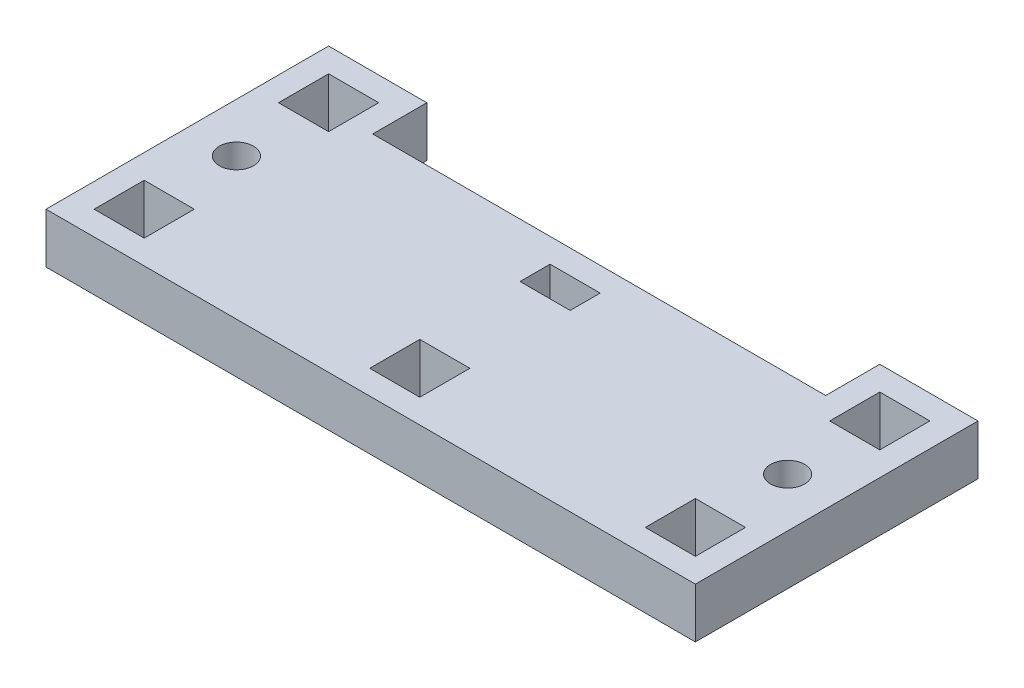
ISO-10303-21;
HEADER;
FILE_DESCRIPTION(('STEP AP214'),'2;1');
FILE_NAME('part.step','',(''),(''),'','','');
FILE_SCHEMA(('AUTOMOTIVE_DESIGN { 1 0 10303 214 1 1 1 1 }'));
ENDSEC;
DATA;
#1=APPLICATION_CONTEXT('core data for automotive mechanical design processes');
#2=APPLICATION_PROTOCOL_DEFINITION('international standard','automotive_design',2000,#1);
#3=PRODUCT_CONTEXT('',#1,'mechanical');
#4=PRODUCT('Part','Part','',(#3));
#5=PRODUCT_RELATED_PRODUCT_CATEGORY('part','',(#4));
#6=PRODUCT_DEFINITION_FORMATION('','',#4);
#7=PRODUCT_DEFINITION_CONTEXT('part definition',#1,'design');
#8=PRODUCT_DEFINITION('design','',#6,#7);
#9=PRODUCT_DEFINITION_SHAPE('','',#8);
#10=(LENGTH_UNIT() NAMED_UNIT(*) SI_UNIT(.MILLI.,.METRE.));
#11=(NAMED_UNIT(*) PLANE_ANGLE_UNIT() SI_UNIT($,.RADIAN.));
#12=(NAMED_UNIT(*) SI_UNIT($,.STERADIAN.) SOLID_ANGLE_UNIT());
#13=UNCERTAINTY_MEASURE_WITH_UNIT(LENGTH_MEASURE(1.E-05),#10,'distance_accuracy_value','');
#14=(GEOMETRIC_REPRESENTATION_CONTEXT(3) GLOBAL_UNCERTAINTY_ASSIGNED_CONTEXT((#13)) GLOBAL_UNIT_ASSIGNED_CONTEXT((#10,
#11,#12)) REPRESENTATION_CONTEXT('',''));
#15=CARTESIAN_POINT('',(0.,0.,0.));
#16=DIRECTION('',(0.,0.,1.));
#17=DIRECTION('',(1.,0.,0.));
#18=AXIS2_PLACEMENT_3D('',#15,#16,#17);
#19=CARTESIAN_POINT('',(0.,6.35,0.));
#20=DIRECTION('',(0.,1.,0.));
#21=DIRECTION('',(0.,0.,1.));
#22=AXIS2_PLACEMENT_3D('',#19,#20,#21);
#23=PLANE('',#22);
#24=CARTESIAN_POINT('',(-34.925,6.34999999999966,0.));
#25=DIRECTION('',(0.,1.,0.));
#26=DIRECTION('',(1.,0.,0.));
#27=AXIS2_PLACEMENT_3D('',#24,#25,#26);
#28=CIRCLE('',#27,2.159);
#29=CARTESIAN_POINT('',(-32.766,6.34999999999968,0.));
#30=VERTEX_POINT('',#29);
#31=EDGE_CURVE('E278',#30,#30,#28,.T.);
#32=ORIENTED_EDGE('',*,*,#31,.F.);
#33=EDGE_LOOP('',(#32));
#34=FACE_BOUND('',#33,.T.);
#35=DIRECTION('',(1.,0.,0.));
#36=VECTOR('',#35,1.);
#37=CARTESIAN_POINT('',(31.75,6.35,14.859));
#38=LINE('',#37,#36);
#39=CARTESIAN_POINT('',(31.75,6.35,14.859));
#40=VERTEX_POINT('',#39);
#41=CARTESIAN_POINT('',(38.1,6.35,14.859));
#42=VERTEX_POINT('',#41);
#43=EDGE_CURVE('E317',#40,#42,#38,.T.);
#44=ORIENTED_EDGE('',*,*,#43,.F.);
#45=DIRECTION('',(0.,0.,1.));
#46=VECTOR('',#45,1.);
#47=CARTESIAN_POINT('',(31.75,6.35,8.509));
#48=LINE('',#47,#46);
#49=CARTESIAN_POINT('',(31.75,6.35,8.509));
#50=VERTEX_POINT('',#49);
#51=EDGE_CURVE('E315',#50,#40,#48,.T.);
#52=ORIENTED_EDGE('',*,*,#51,.F.);
#53=DIRECTION('',(-1.,0.,0.));
#54=VECTOR('',#53,1.);
#55=CARTESIAN_POINT('',(31.75,6.35,8.509));
#56=LINE('',#55,#54);
#57=CARTESIAN_POINT('',(38.1,6.35,8.509));
#58=VERTEX_POINT('',#57);
#59=EDGE_CURVE('E323',#58,#50,#56,.T.);
#60=ORIENTED_EDGE('',*,*,#59,.F.);
#61=DIRECTION('',(0.,0.,-1.));
#62=VECTOR('',#61,1.);
#63=CARTESIAN_POINT('',(38.1,6.35,8.509));
#64=LINE('',#63,#62);
#65=EDGE_CURVE('E320',#42,#58,#64,.T.);
#66=ORIENTED_EDGE('',*,*,#65,.F.);
#67=EDGE_LOOP('',(#44,#52,#60,#66));
#68=FACE_BOUND('',#67,.T.);
#69=DIRECTION('',(-1.,0.,0.));
#70=VECTOR('',#69,1.);
#71=CARTESIAN_POINT('',(31.75,6.35,-14.859));
#72=LINE('',#71,#70);
#73=CARTESIAN_POINT('',(38.1,6.35,-14.859));
#74=VERTEX_POINT('',#73);
#75=CARTESIAN_POINT('',(31.75,6.35,-14.859));
#76=VERTEX_POINT('',#75);
#77=EDGE_CURVE('E354',#74,#76,#72,.T.);
#78=ORIENTED_EDGE('',*,*,#77,.F.);
#79=DIRECTION('',(0.,0.,-1.));
#80=VECTOR('',#79,1.);
#81=CARTESIAN_POINT('',(38.1,6.35,-8.509));
#82=LINE('',#81,#80);
#83=CARTESIAN_POINT('',(38.1,6.35,-8.509));
#84=VERTEX_POINT('',#83);
#85=EDGE_CURVE('E352',#84,#74,#82,.T.);
#86=ORIENTED_EDGE('',*,*,#85,.F.);
#87=DIRECTION('',(1.,0.,0.));
#88=VECTOR('',#87,1.);
#89=CARTESIAN_POINT('',(31.75,6.35,-8.509));
#90=LINE('',#89,#88);
#91=CARTESIAN_POINT('',(31.75,6.35,-8.509));
#92=VERTEX_POINT('',#91);
#93=EDGE_CURVE('E360',#92,#84,#90,.T.);
#94=ORIENTED_EDGE('',*,*,#93,.F.);
#95=DIRECTION('',(0.,0.,1.));
#96=VECTOR('',#95,1.);
#97=CARTESIAN_POINT('',(31.75,6.35,-8.509));
#98=LINE('',#97,#96);
#99=EDGE_CURVE('E357',#76,#92,#98,.T.);
#100=ORIENTED_EDGE('',*,*,#99,.F.);
#101=EDGE_LOOP('',(#78,#86,#94,#100));
#102=FACE_BOUND('',#101,.T.);
#103=DIRECTION('',(-1.,0.,0.));
#104=VECTOR('',#103,1.);
#105=CARTESIAN_POINT('',(-3.175,6.35,8.50899999999999));
#106=LINE('',#105,#104);
#107=CARTESIAN_POINT('',(3.175,6.35,8.50899999999999));
#108=VERTEX_POINT('',#107);
#109=CARTESIAN_POINT('',(-3.175,6.35,8.50899999999999));
#110=VERTEX_POINT('',#109);
#111=EDGE_CURVE('E416',#108,#110,#106,.T.);
#112=ORIENTED_EDGE('',*,*,#111,.F.);
#113=DIRECTION('',(0.,0.,-1.));
#114=VECTOR('',#113,1.);
#115=CARTESIAN_POINT('',(3.175,6.35,8.50899999999999));
#116=LINE('',#115,#114);
#117=CARTESIAN_POINT('',(3.175,6.35,14.859));
#118=VERTEX_POINT('',#117);
#119=EDGE_CURVE('E414',#118,#108,#116,.T.);
#120=ORIENTED_EDGE('',*,*,#119,.F.);
#121=DIRECTION('',(1.,0.,0.));
#122=VECTOR('',#121,1.);
#123=CARTESIAN_POINT('',(-3.175,6.35,14.859));
#124=LINE('',#123,#122);
#125=CARTESIAN_POINT('',(-3.175,6.35,14.859));
#126=VERTEX_POINT('',#125);
#127=EDGE_CURVE('E422',#126,#118,#124,.T.);
#128=ORIENTED_EDGE('',*,*,#127,.F.);
#129=DIRECTION('',(0.,0.,1.));
#130=VECTOR('',#129,1.);
#131=CARTESIAN_POINT('',(-3.175,6.35,8.50899999999999));
#132=LINE('',#131,#130);
#133=EDGE_CURVE('E419',#110,#126,#132,.T.);
#134=ORIENTED_EDGE('',*,*,#133,.F.);
#135=EDGE_LOOP('',(#112,#120,#128,#134));
#136=FACE_BOUND('',#135,.T.);
#137=DIRECTION('',(-1.,0.,0.));
#138=VECTOR('',#137,1.);
#139=CARTESIAN_POINT('',(28.702,6.35,-17.907));
#140=LINE('',#139,#138);
#141=CARTESIAN_POINT('',(41.148,6.35,-17.907));
#142=VERTEX_POINT('',#141);
#143=CARTESIAN_POINT('',(28.702,6.35,-17.907));
#144=VERTEX_POINT('',#143);
#145=EDGE_CURVE('E445',#142,#144,#140,.T.);
#146=ORIENTED_EDGE('',*,*,#145,.T.);
#147=DIRECTION('',(0.,0.,1.));
#148=VECTOR('',#147,1.);
#149=CARTESIAN_POINT('',(28.702,6.35,-11.049));
#150=LINE('',#149,#148);
#151=CARTESIAN_POINT('',(28.702,6.35,-11.049));
#152=VERTEX_POINT('',#151);
#153=EDGE_CURVE('E448',#144,#152,#150,.T.);
#154=ORIENTED_EDGE('',*,*,#153,.T.);
#155=DIRECTION('',(-1.,0.,0.));
#156=VECTOR('',#155,1.);
#157=CARTESIAN_POINT('',(-28.702,6.35,-11.049));
#158=LINE('',#157,#156);
#159=CARTESIAN_POINT('',(-28.702,6.35,-11.049));
#160=VERTEX_POINT('',#159);
#161=EDGE_CURVE('E451',#152,#160,#158,.T.);
#162=ORIENTED_EDGE('',*,*,#161,.T.);
#163=DIRECTION('',(0.,0.,-1.));
#164=VECTOR('',#163,1.);
#165=CARTESIAN_POINT('',(-28.702,6.35,-17.907));
#166=LINE('',#165,#164);
#167=CARTESIAN_POINT('',(-28.702,6.35,-17.907));
#168=VERTEX_POINT('',#167);
#169=EDGE_CURVE('E453',#160,#168,#166,.T.);
#170=ORIENTED_EDGE('',*,*,#169,.T.);
#171=DIRECTION('',(-1.,0.,0.));
#172=VECTOR('',#171,1.);
#173=CARTESIAN_POINT('',(-41.148,6.35,-17.907));
#174=LINE('',#173,#172);
#175=CARTESIAN_POINT('',(-41.148,6.35,-17.907));
#176=VERTEX_POINT('',#175);
#177=EDGE_CURVE('E455',#168,#176,#174,.T.);
#178=ORIENTED_EDGE('',*,*,#177,.T.);
#179=DIRECTION('',(0.,0.,1.));
#180=VECTOR('',#179,1.);
#181=CARTESIAN_POINT('',(-41.148,6.35,17.907));
#182=LINE('',#181,#180);
#183=CARTESIAN_POINT('',(-41.148,6.35,17.907));
#184=VERTEX_POINT('',#183);
#185=EDGE_CURVE('E457',#176,#184,#182,.T.);
#186=ORIENTED_EDGE('',*,*,#185,.T.);
#187=DIRECTION('',(1.,0.,0.));
#188=VECTOR('',#187,1.);
#189=CARTESIAN_POINT('',(-41.148,6.35,17.907));
#190=LINE('',#189,#188);
#191=CARTESIAN_POINT('',(41.148,6.35,17.907));
#192=VERTEX_POINT('',#191);
#193=EDGE_CURVE('E459',#184,#192,#190,.T.);
#194=ORIENTED_EDGE('',*,*,#193,.T.);
#195=DIRECTION('',(0.,0.,-1.));
#196=VECTOR('',#195,1.);
#197=CARTESIAN_POINT('',(41.148,6.35,17.907));
#198=LINE('',#197,#196);
#199=EDGE_CURVE('E461',#192,#142,#198,.T.);
#200=ORIENTED_EDGE('',*,*,#199,.T.);
#201=EDGE_LOOP('',(#146,#154,#162,#170,#178,#186,#194,#200));
#202=FACE_BOUND('',#201,.T.);
#203=DIRECTION('',(-1.,0.,0.));
#204=VECTOR('',#203,1.);
#205=CARTESIAN_POINT('',(-3.175,6.35,-8.00100000000001));
#206=LINE('',#205,#204);
#207=CARTESIAN_POINT('',(3.175,6.35,-8.00100000000001));
#208=VERTEX_POINT('',#207);
#209=CARTESIAN_POINT('',(-3.175,6.35,-8.00100000000001));
#210=VERTEX_POINT('',#209);
#211=EDGE_CURVE('E385',#208,#210,#206,.T.);
#212=ORIENTED_EDGE('',*,*,#211,.F.);
#213=DIRECTION('',(0.,0.,-1.));
#214=VECTOR('',#213,1.);
#215=CARTESIAN_POINT('',(3.175,6.35,-4.19100000000001));
#216=LINE('',#215,#214);
#217=CARTESIAN_POINT('',(3.175,6.35,-4.19100000000001));
#218=VERTEX_POINT('',#217);
#219=EDGE_CURVE('E383',#218,#208,#216,.T.);
#220=ORIENTED_EDGE('',*,*,#219,.F.);
#221=DIRECTION('',(1.,0.,0.));
#222=VECTOR('',#221,1.);
#223=CARTESIAN_POINT('',(-3.175,6.35,-4.19100000000001));
#224=LINE('',#223,#222);
#225=CARTESIAN_POINT('',(-3.175,6.35,-4.19100000000001));
#226=VERTEX_POINT('',#225);
#227=EDGE_CURVE('E391',#226,#218,#224,.T.);
#228=ORIENTED_EDGE('',*,*,#227,.F.);
#229=DIRECTION('',(0.,0.,1.));
#230=VECTOR('',#229,1.);
#231=CARTESIAN_POINT('',(-3.175,6.35,-4.19100000000001));
#232=LINE('',#231,#230);
#233=EDGE_CURVE('E388',#210,#226,#232,.T.);
#234=ORIENTED_EDGE('',*,*,#233,.F.);
#235=EDGE_LOOP('',(#212,#220,#228,#234));
#236=FACE_BOUND('',#235,.T.);
#237=CARTESIAN_POINT('',(34.925,6.35,0.));
#238=DIRECTION('',(0.,1.,0.));
#239=DIRECTION('',(0.,0.,1.));
#240=AXIS2_PLACEMENT_3D('',#237,#238,#239);
#241=CIRCLE('',#240,2.159);
#242=CARTESIAN_POINT('',(34.925,6.35,2.159));
#243=VERTEX_POINT('',#242);
#244=EDGE_CURVE('E346',#243,#243,#241,.T.);
#245=ORIENTED_EDGE('',*,*,#244,.F.);
#246=EDGE_LOOP('',(#245));
#247=FACE_BOUND('',#246,.T.);
#248=DIRECTION('',(1.,0.,0.));
#249=VECTOR('',#248,1.);
#250=CARTESIAN_POINT('',(-31.75,6.34999999999968,-8.50899999999999));
#251=LINE('',#250,#249);
#252=CARTESIAN_POINT('',(-38.1,6.34999999999964,-8.50899999999999));
#253=VERTEX_POINT('',#252);
#254=CARTESIAN_POINT('',(-31.75,6.34999999999968,-8.50899999999999));
#255=VERTEX_POINT('',#254);
#256=EDGE_CURVE('E286',#253,#255,#251,.T.);
#257=ORIENTED_EDGE('',*,*,#256,.F.);
#258=DIRECTION('',(0.,0.,1.));
#259=VECTOR('',#258,1.);
#260=CARTESIAN_POINT('',(-38.1,6.34999999999964,-8.50899999999999));
#261=LINE('',#260,#259);
#262=CARTESIAN_POINT('',(-38.1,6.34999999999964,-14.859));
#263=VERTEX_POINT('',#262);
#264=EDGE_CURVE('E284',#263,#253,#261,.T.);
#265=ORIENTED_EDGE('',*,*,#264,.F.);
#266=DIRECTION('',(-1.,0.,0.));
#267=VECTOR('',#266,1.);
#268=CARTESIAN_POINT('',(-31.75,6.34999999999968,-14.859));
#269=LINE('',#268,#267);
#270=CARTESIAN_POINT('',(-31.75,6.35,-14.859));
#271=VERTEX_POINT('',#270);
#272=EDGE_CURVE('E292',#271,#263,#269,.T.);
#273=ORIENTED_EDGE('',*,*,#272,.F.);
#274=DIRECTION('',(0.,0.,-1.));
#275=VECTOR('',#274,1.);
#276=CARTESIAN_POINT('',(-31.75,6.34999999999968,-8.50899999999999));
#277=LINE('',#276,#275);
#278=EDGE_CURVE('E289',#255,#271,#277,.T.);
#279=ORIENTED_EDGE('',*,*,#278,.F.);
#280=EDGE_LOOP('',(#257,#265,#273,#279));
#281=FACE_BOUND('',#280,.T.);
#282=DIRECTION('',(-1.,0.,0.));
#283=VECTOR('',#282,1.);
#284=CARTESIAN_POINT('',(-31.75,6.34999999999968,8.509));
#285=LINE('',#284,#283);
#286=CARTESIAN_POINT('',(-31.75,6.34999999999968,8.509));
#287=VERTEX_POINT('',#286);
#288=CARTESIAN_POINT('',(-38.1,6.34999999999964,8.509));
#289=VERTEX_POINT('',#288);
#290=EDGE_CURVE('E250',#287,#289,#285,.T.);
#291=ORIENTED_EDGE('',*,*,#290,.F.);
#292=DIRECTION('',(0.,0.,-1.));
#293=VECTOR('',#292,1.);
#294=CARTESIAN_POINT('',(-31.75,6.34999999999968,8.509));
#295=LINE('',#294,#293);
#296=CARTESIAN_POINT('',(-31.75,6.34999999999968,14.859));
#297=VERTEX_POINT('',#296);
#298=EDGE_CURVE('E242',#297,#287,#295,.T.);
#299=ORIENTED_EDGE('',*,*,#298,.F.);
#300=DIRECTION('',(1.,0.,0.));
#301=VECTOR('',#300,1.);
#302=CARTESIAN_POINT('',(-31.75,6.34999999999968,14.859));
#303=LINE('',#302,#301);
#304=CARTESIAN_POINT('',(-38.1,6.35,14.859));
#305=VERTEX_POINT('',#304);
#306=EDGE_CURVE('E264',#305,#297,#303,.T.);
#307=ORIENTED_EDGE('',*,*,#306,.F.);
#308=DIRECTION('',(0.,0.,1.));
#309=VECTOR('',#308,1.);
#310=CARTESIAN_POINT('',(-38.1,6.34999999999964,8.509));
#311=LINE('',#310,#309);
#312=EDGE_CURVE('E262',#289,#305,#311,.T.);
#313=ORIENTED_EDGE('',*,*,#312,.F.);
#314=EDGE_LOOP('',(#291,#299,#307,#313));
#315=FACE_BOUND('',#314,.T.);
#316=ADVANCED_FACE('F33',(#34,#68,#102,#136,#202,#236,#247,#281,#315),#23,.T.);
#317=CARTESIAN_POINT('',(0.,0.,0.));
#318=DIRECTION('',(0.,1.,0.));
#319=DIRECTION('',(0.,0.,1.));
#320=AXIS2_PLACEMENT_3D('',#317,#318,#319);
#321=PLANE('',#320);
#322=CARTESIAN_POINT('',(-34.925,-3.38598395391725E-13,0.));
#323=DIRECTION('',(0.,1.,0.));
#324=DIRECTION('',(1.,0.,0.));
#325=AXIS2_PLACEMENT_3D('',#322,#323,#324);
#326=CIRCLE('',#325,2.159);
#327=CARTESIAN_POINT('',(-32.766,-3.23522170238455E-13,0.));
#328=VERTEX_POINT('',#327);
#329=EDGE_CURVE('E258',#328,#328,#326,.T.);
#330=ORIENTED_EDGE('',*,*,#329,.T.);
#331=EDGE_LOOP('',(#330));
#332=FACE_BOUND('',#331,.T.);
#333=DIRECTION('',(0.,0.,1.));
#334=VECTOR('',#333,1.);
#335=CARTESIAN_POINT('',(31.75,0.,8.509));
#336=LINE('',#335,#334);
#337=CARTESIAN_POINT('',(31.75,0.,8.509));
#338=VERTEX_POINT('',#337);
#339=CARTESIAN_POINT('',(31.75,0.,14.859));
#340=VERTEX_POINT('',#339);
#341=EDGE_CURVE('E314',#338,#340,#336,.T.);
#342=ORIENTED_EDGE('',*,*,#341,.T.);
#343=DIRECTION('',(1.,0.,0.));
#344=VECTOR('',#343,1.);
#345=CARTESIAN_POINT('',(31.75,0.,14.859));
#346=LINE('',#345,#344);
#347=CARTESIAN_POINT('',(38.1,0.,14.859));
#348=VERTEX_POINT('',#347);
#349=EDGE_CURVE('E328',#340,#348,#346,.T.);
#350=ORIENTED_EDGE('',*,*,#349,.T.);
#351=DIRECTION('',(0.,0.,-1.));
#352=VECTOR('',#351,1.);
#353=CARTESIAN_POINT('',(38.1,0.,8.509));
#354=LINE('',#353,#352);
#355=CARTESIAN_POINT('',(38.1,0.,8.509));
#356=VERTEX_POINT('',#355);
#357=EDGE_CURVE('E331',#348,#356,#354,.T.);
#358=ORIENTED_EDGE('',*,*,#357,.T.);
#359=DIRECTION('',(-1.,0.,0.));
#360=VECTOR('',#359,1.);
#361=CARTESIAN_POINT('',(31.75,0.,8.509));
#362=LINE('',#361,#360);
#363=EDGE_CURVE('E318',#356,#338,#362,.T.);
#364=ORIENTED_EDGE('',*,*,#363,.T.);
#365=EDGE_LOOP('',(#342,#350,#358,#364));
#366=FACE_BOUND('',#365,.T.);
#367=DIRECTION('',(0.,0.,-1.));
#368=VECTOR('',#367,1.);
#369=CARTESIAN_POINT('',(38.1,0.,-8.509));
#370=LINE('',#369,#368);
#371=CARTESIAN_POINT('',(38.1,0.,-8.509));
#372=VERTEX_POINT('',#371);
#373=CARTESIAN_POINT('',(38.1,0.,-14.859));
#374=VERTEX_POINT('',#373);
#375=EDGE_CURVE('E349',#372,#374,#370,.T.);
#376=ORIENTED_EDGE('',*,*,#375,.T.);
#377=DIRECTION('',(-1.,0.,0.));
#378=VECTOR('',#377,1.);
#379=CARTESIAN_POINT('',(31.75,0.,-14.859));
#380=LINE('',#379,#378);
#381=CARTESIAN_POINT('',(31.75,0.,-14.859));
#382=VERTEX_POINT('',#381);
#383=EDGE_CURVE('E365',#374,#382,#380,.T.);
#384=ORIENTED_EDGE('',*,*,#383,.T.);
#385=DIRECTION('',(0.,0.,1.));
#386=VECTOR('',#385,1.);
#387=CARTESIAN_POINT('',(31.75,0.,-8.509));
#388=LINE('',#387,#386);
#389=CARTESIAN_POINT('',(31.75,0.,-8.509));
#390=VERTEX_POINT('',#389);
#391=EDGE_CURVE('E368',#382,#390,#388,.T.);
#392=ORIENTED_EDGE('',*,*,#391,.T.);
#393=DIRECTION('',(1.,0.,0.));
#394=VECTOR('',#393,1.);
#395=CARTESIAN_POINT('',(31.75,0.,-8.509));
#396=LINE('',#395,#394);
#397=EDGE_CURVE('E355',#390,#372,#396,.T.);
#398=ORIENTED_EDGE('',*,*,#397,.T.);
#399=EDGE_LOOP('',(#376,#384,#392,#398));
#400=FACE_BOUND('',#399,.T.);
#401=DIRECTION('',(0.,0.,-1.));
#402=VECTOR('',#401,1.);
#403=CARTESIAN_POINT('',(3.175,0.,8.50899999999999));
#404=LINE('',#403,#402);
#405=CARTESIAN_POINT('',(3.175,0.,14.859));
#406=VERTEX_POINT('',#405);
#407=CARTESIAN_POINT('',(3.175,0.,8.50899999999999));
#408=VERTEX_POINT('',#407);
#409=EDGE_CURVE('E413',#406,#408,#404,.T.);
#410=ORIENTED_EDGE('',*,*,#409,.T.);
#411=DIRECTION('',(-1.,0.,0.));
#412=VECTOR('',#411,1.);
#413=CARTESIAN_POINT('',(-3.175,0.,8.50899999999999));
#414=LINE('',#413,#412);
#415=CARTESIAN_POINT('',(-3.175,0.,8.50899999999999));
#416=VERTEX_POINT('',#415);
#417=EDGE_CURVE('E427',#408,#416,#414,.T.);
#418=ORIENTED_EDGE('',*,*,#417,.T.);
#419=DIRECTION('',(0.,0.,1.));
#420=VECTOR('',#419,1.);
#421=CARTESIAN_POINT('',(-3.175,0.,8.50899999999999));
#422=LINE('',#421,#420);
#423=CARTESIAN_POINT('',(-3.175,0.,14.859));
#424=VERTEX_POINT('',#423);
#425=EDGE_CURVE('E430',#416,#424,#422,.T.);
#426=ORIENTED_EDGE('',*,*,#425,.T.);
#427=DIRECTION('',(1.,0.,0.));
#428=VECTOR('',#427,1.);
#429=CARTESIAN_POINT('',(-3.175,0.,14.859));
#430=LINE('',#429,#428);
#431=EDGE_CURVE('E417',#424,#406,#430,.T.);
#432=ORIENTED_EDGE('',*,*,#431,.T.);
#433=EDGE_LOOP('',(#410,#418,#426,#432));
#434=FACE_BOUND('',#433,.T.);
#435=DIRECTION('',(-1.,0.,0.));
#436=VECTOR('',#435,1.);
#437=CARTESIAN_POINT('',(28.702,0.,-17.907));
#438=LINE('',#437,#436);
#439=CARTESIAN_POINT('',(41.148,0.,-17.907));
#440=VERTEX_POINT('',#439);
#441=CARTESIAN_POINT('',(28.702,0.,-17.907));
#442=VERTEX_POINT('',#441);
#443=EDGE_CURVE('E444',#440,#442,#438,.T.);
#444=ORIENTED_EDGE('',*,*,#443,.F.);
#445=DIRECTION('',(0.,0.,-1.));
#446=VECTOR('',#445,1.);
#447=CARTESIAN_POINT('',(41.148,0.,17.907));
#448=LINE('',#447,#446);
#449=CARTESIAN_POINT('',(41.148,0.,17.907));
#450=VERTEX_POINT('',#449);
#451=EDGE_CURVE('E449',#450,#440,#448,.T.);
#452=ORIENTED_EDGE('',*,*,#451,.F.);
#453=DIRECTION('',(1.,0.,0.));
#454=VECTOR('',#453,1.);
#455=CARTESIAN_POINT('',(-41.148,0.,17.907));
#456=LINE('',#455,#454);
#457=CARTESIAN_POINT('',(-41.148,0.,17.907));
#458=VERTEX_POINT('',#457);
#459=EDGE_CURVE('E476',#458,#450,#456,.T.);
#460=ORIENTED_EDGE('',*,*,#459,.F.);
#461=DIRECTION('',(0.,0.,1.));
#462=VECTOR('',#461,1.);
#463=CARTESIAN_POINT('',(-41.148,0.,17.907));
#464=LINE('',#463,#462);
#465=CARTESIAN_POINT('',(-41.148,0.,-17.907));
#466=VERTEX_POINT('',#465);
#467=EDGE_CURVE('E474',#466,#458,#464,.T.);
#468=ORIENTED_EDGE('',*,*,#467,.F.);
#469=DIRECTION('',(-1.,0.,0.));
#470=VECTOR('',#469,1.);
#471=CARTESIAN_POINT('',(-41.148,0.,-17.907));
#472=LINE('',#471,#470);
#473=CARTESIAN_POINT('',(-28.702,0.,-17.907));
#474=VERTEX_POINT('',#473);
#475=EDGE_CURVE('E472',#474,#466,#472,.T.);
#476=ORIENTED_EDGE('',*,*,#475,.F.);
#477=DIRECTION('',(0.,0.,-1.));
#478=VECTOR('',#477,1.);
#479=CARTESIAN_POINT('',(-28.702,0.,-17.907));
#480=LINE('',#479,#478);
#481=CARTESIAN_POINT('',(-28.702,0.,-11.049));
#482=VERTEX_POINT('',#481);
#483=EDGE_CURVE('E470',#482,#474,#480,.T.);
#484=ORIENTED_EDGE('',*,*,#483,.F.);
#485=DIRECTION('',(-1.,0.,0.));
#486=VECTOR('',#485,1.);
#487=CARTESIAN_POINT('',(-28.702,0.,-11.049));
#488=LINE('',#487,#486);
#489=CARTESIAN_POINT('',(28.702,0.,-11.049));
#490=VERTEX_POINT('',#489);
#491=EDGE_CURVE('E468',#490,#482,#488,.T.);
#492=ORIENTED_EDGE('',*,*,#491,.F.);
#493=DIRECTION('',(0.,0.,1.));
#494=VECTOR('',#493,1.);
#495=CARTESIAN_POINT('',(28.702,0.,-11.049));
#496=LINE('',#495,#494);
#497=EDGE_CURVE('E466',#442,#490,#496,.T.);
#498=ORIENTED_EDGE('',*,*,#497,.F.);
#499=EDGE_LOOP('',(#444,#452,#460,#468,#476,#484,#492,#498));
#500=FACE_BOUND('',#499,.T.);
#501=DIRECTION('',(0.,0.,-1.));
#502=VECTOR('',#501,1.);
#503=CARTESIAN_POINT('',(3.175,0.,-4.19100000000001));
#504=LINE('',#503,#502);
#505=CARTESIAN_POINT('',(3.175,0.,-4.19100000000001));
#506=VERTEX_POINT('',#505);
#507=CARTESIAN_POINT('',(3.175,0.,-8.00100000000001));
#508=VERTEX_POINT('',#507);
#509=EDGE_CURVE('E382',#506,#508,#504,.T.);
#510=ORIENTED_EDGE('',*,*,#509,.T.);
#511=DIRECTION('',(-1.,0.,0.));
#512=VECTOR('',#511,1.);
#513=CARTESIAN_POINT('',(-3.175,0.,-8.00100000000001));
#514=LINE('',#513,#512);
#515=CARTESIAN_POINT('',(-3.175,0.,-8.00100000000001));
#516=VERTEX_POINT('',#515);
#517=EDGE_CURVE('E396',#508,#516,#514,.T.);
#518=ORIENTED_EDGE('',*,*,#517,.T.);
#519=DIRECTION('',(0.,0.,1.));
#520=VECTOR('',#519,1.);
#521=CARTESIAN_POINT('',(-3.175,0.,-4.19100000000001));
#522=LINE('',#521,#520);
#523=CARTESIAN_POINT('',(-3.175,0.,-4.19100000000001));
#524=VERTEX_POINT('',#523);
#525=EDGE_CURVE('E399',#516,#524,#522,.T.);
#526=ORIENTED_EDGE('',*,*,#525,.T.);
#527=DIRECTION('',(1.,0.,0.));
#528=VECTOR('',#527,1.);
#529=CARTESIAN_POINT('',(-3.175,0.,-4.19100000000001));
#530=LINE('',#529,#528);
#531=EDGE_CURVE('E386',#524,#506,#530,.T.);
#532=ORIENTED_EDGE('',*,*,#531,.T.);
#533=EDGE_LOOP('',(#510,#518,#526,#532));
#534=FACE_BOUND('',#533,.T.);
#535=CARTESIAN_POINT('',(34.925,0.,0.));
#536=DIRECTION('',(0.,1.,0.));
#537=DIRECTION('',(0.,0.,1.));
#538=AXIS2_PLACEMENT_3D('',#535,#536,#537);
#539=CIRCLE('',#538,2.159);
#540=CARTESIAN_POINT('',(34.925,0.,2.159));
#541=VERTEX_POINT('',#540);
#542=EDGE_CURVE('E345',#541,#541,#539,.T.);
#543=ORIENTED_EDGE('',*,*,#542,.T.);
#544=EDGE_LOOP('',(#543));
#545=FACE_BOUND('',#544,.T.);
#546=DIRECTION('',(0.,0.,1.));
#547=VECTOR('',#546,1.);
#548=CARTESIAN_POINT('',(-38.1,-3.60769314734769E-13,-8.50899999999999));
#549=LINE('',#548,#547);
#550=CARTESIAN_POINT('',(-38.1,0.,-14.859));
#551=VERTEX_POINT('',#550);
#552=CARTESIAN_POINT('',(-38.1,-3.60769314734769E-13,-8.50899999999999));
#553=VERTEX_POINT('',#552);
#554=EDGE_CURVE('E281',#551,#553,#549,.T.);
#555=ORIENTED_EDGE('',*,*,#554,.T.);
#556=DIRECTION('',(1.,0.,0.));
#557=VECTOR('',#556,1.);
#558=CARTESIAN_POINT('',(-31.75,-3.1642747604868E-13,-8.50899999999999));
#559=LINE('',#558,#557);
#560=CARTESIAN_POINT('',(-31.75,-3.1642747604868E-13,-8.50899999999999));
#561=VERTEX_POINT('',#560);
#562=EDGE_CURVE('E297',#553,#561,#559,.T.);
#563=ORIENTED_EDGE('',*,*,#562,.T.);
#564=DIRECTION('',(0.,0.,-1.));
#565=VECTOR('',#564,1.);
#566=CARTESIAN_POINT('',(-31.75,-3.1642747604868E-13,-8.50899999999999));
#567=LINE('',#566,#565);
#568=CARTESIAN_POINT('',(-31.75,-3.1642747604868E-13,-14.859));
#569=VERTEX_POINT('',#568);
#570=EDGE_CURVE('E300',#561,#569,#567,.T.);
#571=ORIENTED_EDGE('',*,*,#570,.T.);
#572=DIRECTION('',(-1.,0.,0.));
#573=VECTOR('',#572,1.);
#574=CARTESIAN_POINT('',(-31.75,-3.1642747604868E-13,-14.859));
#575=LINE('',#574,#573);
#576=EDGE_CURVE('E287',#569,#551,#575,.T.);
#577=ORIENTED_EDGE('',*,*,#576,.T.);
#578=EDGE_LOOP('',(#555,#563,#571,#577));
#579=FACE_BOUND('',#578,.T.);
#580=DIRECTION('',(0.,0.,-1.));
#581=VECTOR('',#580,1.);
#582=CARTESIAN_POINT('',(-31.75,-3.1642747604868E-13,8.509));
#583=LINE('',#582,#581);
#584=CARTESIAN_POINT('',(-31.75,0.,14.859));
#585=VERTEX_POINT('',#584);
#586=CARTESIAN_POINT('',(-31.75,-3.1642747604868E-13,8.509));
#587=VERTEX_POINT('',#586);
#588=EDGE_CURVE('E56',#585,#587,#583,.T.);
#589=ORIENTED_EDGE('',*,*,#588,.T.);
#590=DIRECTION('',(-1.,0.,0.));
#591=VECTOR('',#590,1.);
#592=CARTESIAN_POINT('',(-31.75,-3.1642747604868E-13,8.509));
#593=LINE('',#592,#591);
#594=CARTESIAN_POINT('',(-38.1,-3.60769314734769E-13,8.509));
#595=VERTEX_POINT('',#594);
#596=EDGE_CURVE('E257',#587,#595,#593,.T.);
#597=ORIENTED_EDGE('',*,*,#596,.T.);
#598=DIRECTION('',(0.,0.,1.));
#599=VECTOR('',#598,1.);
#600=CARTESIAN_POINT('',(-38.1,-3.60769314734769E-13,8.509));
#601=LINE('',#600,#599);
#602=CARTESIAN_POINT('',(-38.1,-3.60769314734769E-13,14.859));
#603=VERTEX_POINT('',#602);
#604=EDGE_CURVE('E270',#595,#603,#601,.T.);
#605=ORIENTED_EDGE('',*,*,#604,.T.);
#606=DIRECTION('',(1.,0.,0.));
#607=VECTOR('',#606,1.);
#608=CARTESIAN_POINT('',(-31.75,-3.1642747604868E-13,14.859));
#609=LINE('',#608,#607);
#610=EDGE_CURVE('E251',#603,#585,#609,.T.);
#611=ORIENTED_EDGE('',*,*,#610,.T.);
#612=EDGE_LOOP('',(#589,#597,#605,#611));
#613=FACE_BOUND('',#612,.T.);
#614=ADVANCED_FACE('F506',(#332,#366,#400,#434,#500,#534,#545,#579,#613),#321,.F.);
#615=CARTESIAN_POINT('',(28.702,6.35,-17.907));
#616=DIRECTION('',(0.,0.,1.));
#617=DIRECTION('',(1.,0.,0.));
#618=AXIS2_PLACEMENT_3D('',#615,#616,#617);
#619=PLANE('',#618);
#620=ORIENTED_EDGE('',*,*,#443,.T.);
#621=DIRECTION('',(0.,-1.,0.));
#622=VECTOR('',#621,1.);
#623=CARTESIAN_POINT('',(28.702,6.35,-17.907));
#624=LINE('',#623,#622);
#625=EDGE_CURVE('E11',#144,#442,#624,.T.);
#626=ORIENTED_EDGE('',*,*,#625,.F.);
#627=ORIENTED_EDGE('',*,*,#145,.F.);
#628=DIRECTION('',(0.,-1.,0.));
#629=VECTOR('',#628,1.);
#630=CARTESIAN_POINT('',(41.148,6.35,-17.907));
#631=LINE('',#630,#629);
#632=EDGE_CURVE('E463',#142,#440,#631,.T.);
#633=ORIENTED_EDGE('',*,*,#632,.T.);
#634=EDGE_LOOP('',(#620,#626,#627,#633));
#635=FACE_BOUND('',#634,.T.);
#636=ADVANCED_FACE('F35',(#635),#619,.F.);
#637=CARTESIAN_POINT('',(28.702,6.35,-11.049));
#638=DIRECTION('',(1.,0.,0.));
#639=DIRECTION('',(0.,0.,-1.));
#640=AXIS2_PLACEMENT_3D('',#637,#638,#639);
#641=PLANE('',#640);
#642=ORIENTED_EDGE('',*,*,#497,.T.);
#643=DIRECTION('',(0.,-1.,0.));
#644=VECTOR('',#643,1.);
#645=CARTESIAN_POINT('',(28.702,6.35,-11.049));
#646=LINE('',#645,#644);
#647=EDGE_CURVE('E41',#152,#490,#646,.T.);
#648=ORIENTED_EDGE('',*,*,#647,.F.);
#649=ORIENTED_EDGE('',*,*,#153,.F.);
#650=ORIENTED_EDGE('',*,*,#625,.T.);
#651=EDGE_LOOP('',(#642,#648,#649,#650));
#652=FACE_BOUND('',#651,.T.);
#653=ADVANCED_FACE('F524',(#652),#641,.F.);
#654=CARTESIAN_POINT('',(-28.702,6.35,-11.049));
#655=DIRECTION('',(0.,0.,1.));
#656=DIRECTION('',(1.,0.,0.));
#657=AXIS2_PLACEMENT_3D('',#654,#655,#656);
#658=PLANE('',#657);
#659=ORIENTED_EDGE('',*,*,#491,.T.);
#660=DIRECTION('',(0.,-1.,0.));
#661=VECTOR('',#660,1.);
#662=CARTESIAN_POINT('',(-28.702,6.35,-11.049));
#663=LINE('',#662,#661);
#664=EDGE_CURVE('E493',#160,#482,#663,.T.);
#665=ORIENTED_EDGE('',*,*,#664,.F.);
#666=ORIENTED_EDGE('',*,*,#161,.F.);
#667=ORIENTED_EDGE('',*,*,#647,.T.);
#668=EDGE_LOOP('',(#659,#665,#666,#667));
#669=FACE_BOUND('',#668,.T.);
#670=ADVANCED_FACE('F500',(#669),#658,.F.);
#671=CARTESIAN_POINT('',(-28.702,6.35,-17.907));
#672=DIRECTION('',(-1.,0.,0.));
#673=DIRECTION('',(0.,0.,1.));
#674=AXIS2_PLACEMENT_3D('',#671,#672,#673);
#675=PLANE('',#674);
#676=ORIENTED_EDGE('',*,*,#483,.T.);
#677=DIRECTION('',(0.,-1.,0.));
#678=VECTOR('',#677,1.);
#679=CARTESIAN_POINT('',(-28.702,6.35,-17.907));
#680=LINE('',#679,#678);
#681=EDGE_CURVE('E490',#168,#474,#680,.T.);
#682=ORIENTED_EDGE('',*,*,#681,.F.);
#683=ORIENTED_EDGE('',*,*,#169,.F.);
#684=ORIENTED_EDGE('',*,*,#664,.T.);
#685=EDGE_LOOP('',(#676,#682,#683,#684));
#686=FACE_BOUND('',#685,.T.);
#687=ADVANCED_FACE('F512',(#686),#675,.F.);
#688=CARTESIAN_POINT('',(-41.148,6.35,-17.907));
#689=DIRECTION('',(0.,0.,1.));
#690=DIRECTION('',(1.,0.,0.));
#691=AXIS2_PLACEMENT_3D('',#688,#689,#690);
#692=PLANE('',#691);
#693=ORIENTED_EDGE('',*,*,#475,.T.);
#694=DIRECTION('',(0.,-1.,0.));
#695=VECTOR('',#694,1.);
#696=CARTESIAN_POINT('',(-41.148,6.35,-17.907));
#697=LINE('',#696,#695);
#698=EDGE_CURVE('E487',#176,#466,#697,.T.);
#699=ORIENTED_EDGE('',*,*,#698,.F.);
#700=ORIENTED_EDGE('',*,*,#177,.F.);
#701=ORIENTED_EDGE('',*,*,#681,.T.);
#702=EDGE_LOOP('',(#693,#699,#700,#701));
#703=FACE_BOUND('',#702,.T.);
#704=ADVANCED_FACE('F516',(#703),#692,.F.);
#705=CARTESIAN_POINT('',(-41.148,6.35,17.907));
#706=DIRECTION('',(1.,0.,0.));
#707=DIRECTION('',(0.,0.,-1.));
#708=AXIS2_PLACEMENT_3D('',#705,#706,#707);
#709=PLANE('',#708);
#710=ORIENTED_EDGE('',*,*,#467,.T.);
#711=DIRECTION('',(0.,-1.,0.));
#712=VECTOR('',#711,1.);
#713=CARTESIAN_POINT('',(-41.148,6.35,17.907));
#714=LINE('',#713,#712);
#715=EDGE_CURVE('E484',#184,#458,#714,.T.);
#716=ORIENTED_EDGE('',*,*,#715,.F.);
#717=ORIENTED_EDGE('',*,*,#185,.F.);
#718=ORIENTED_EDGE('',*,*,#698,.T.);
#719=EDGE_LOOP('',(#710,#716,#717,#718));
#720=FACE_BOUND('',#719,.T.);
#721=ADVANCED_FACE('F537',(#720),#709,.F.);
#722=CARTESIAN_POINT('',(-41.148,6.35,17.907));
#723=DIRECTION('',(0.,0.,-1.));
#724=DIRECTION('',(-1.,0.,0.));
#725=AXIS2_PLACEMENT_3D('',#722,#723,#724);
#726=PLANE('',#725);
#727=ORIENTED_EDGE('',*,*,#459,.T.);
#728=DIRECTION('',(0.,-1.,0.));
#729=VECTOR('',#728,1.);
#730=CARTESIAN_POINT('',(41.148,6.35,17.907));
#731=LINE('',#730,#729);
#732=EDGE_CURVE('E481',#192,#450,#731,.T.);
#733=ORIENTED_EDGE('',*,*,#732,.F.);
#734=ORIENTED_EDGE('',*,*,#193,.F.);
#735=ORIENTED_EDGE('',*,*,#715,.T.);
#736=EDGE_LOOP('',(#727,#733,#734,#735));
#737=FACE_BOUND('',#736,.T.);
#738=ADVANCED_FACE('F535',(#737),#726,.F.);
#739=CARTESIAN_POINT('',(41.148,6.35,17.907));
#740=DIRECTION('',(-1.,0.,0.));
#741=DIRECTION('',(0.,0.,1.));
#742=AXIS2_PLACEMENT_3D('',#739,#740,#741);
#743=PLANE('',#742);
#744=ORIENTED_EDGE('',*,*,#451,.T.);
#745=ORIENTED_EDGE('',*,*,#632,.F.);
#746=ORIENTED_EDGE('',*,*,#199,.F.);
#747=ORIENTED_EDGE('',*,*,#732,.T.);
#748=EDGE_LOOP('',(#744,#745,#746,#747));
#749=FACE_BOUND('',#748,.T.);
#750=ADVANCED_FACE('F530',(#749),#743,.F.);
#751=CARTESIAN_POINT('',(3.175,6.35,8.50899999999999));
#752=DIRECTION('',(-1.,0.,0.));
#753=DIRECTION('',(0.,0.,1.));
#754=AXIS2_PLACEMENT_3D('',#751,#752,#753);
#755=PLANE('',#754);
#756=ORIENTED_EDGE('',*,*,#409,.F.);
#757=DIRECTION('',(0.,-1.,0.));
#758=VECTOR('',#757,1.);
#759=CARTESIAN_POINT('',(3.175,6.35,14.859));
#760=LINE('',#759,#758);
#761=EDGE_CURVE('E424',#118,#406,#760,.T.);
#762=ORIENTED_EDGE('',*,*,#761,.F.);
#763=ORIENTED_EDGE('',*,*,#119,.T.);
#764=DIRECTION('',(0.,-1.,0.));
#765=VECTOR('',#764,1.);
#766=CARTESIAN_POINT('',(3.175,6.35,8.50899999999999));
#767=LINE('',#766,#765);
#768=EDGE_CURVE('E441',#108,#408,#767,.T.);
#769=ORIENTED_EDGE('',*,*,#768,.T.);
#770=EDGE_LOOP('',(#756,#762,#763,#769));
#771=FACE_BOUND('',#770,.T.);
#772=ADVANCED_FACE('F557',(#771),#755,.T.);
#773=CARTESIAN_POINT('',(-3.175,6.35,8.50899999999999));
#774=DIRECTION('',(0.,0.,1.));
#775=DIRECTION('',(1.,0.,0.));
#776=AXIS2_PLACEMENT_3D('',#773,#774,#775);
#777=PLANE('',#776);
#778=ORIENTED_EDGE('',*,*,#417,.F.);
#779=ORIENTED_EDGE('',*,*,#768,.F.);
#780=ORIENTED_EDGE('',*,*,#111,.T.);
#781=DIRECTION('',(0.,-1.,0.));
#782=VECTOR('',#781,1.);
#783=CARTESIAN_POINT('',(-3.175,6.35,8.50899999999999));
#784=LINE('',#783,#782);
#785=EDGE_CURVE('E439',#110,#416,#784,.T.);
#786=ORIENTED_EDGE('',*,*,#785,.T.);
#787=EDGE_LOOP('',(#778,#779,#780,#786));
#788=FACE_BOUND('',#787,.T.);
#789=ADVANCED_FACE('F564',(#788),#777,.T.);
#790=CARTESIAN_POINT('',(-3.175,6.35,8.50899999999999));
#791=DIRECTION('',(1.,0.,0.));
#792=DIRECTION('',(0.,0.,-1.));
#793=AXIS2_PLACEMENT_3D('',#790,#791,#792);
#794=PLANE('',#793);
#795=ORIENTED_EDGE('',*,*,#425,.F.);
#796=ORIENTED_EDGE('',*,*,#785,.F.);
#797=ORIENTED_EDGE('',*,*,#133,.T.);
#798=DIRECTION('',(0.,-1.,0.));
#799=VECTOR('',#798,1.);
#800=CARTESIAN_POINT('',(-3.175,6.35,14.859));
#801=LINE('',#800,#799);
#802=EDGE_CURVE('E437',#126,#424,#801,.T.);
#803=ORIENTED_EDGE('',*,*,#802,.T.);
#804=EDGE_LOOP('',(#795,#796,#797,#803));
#805=FACE_BOUND('',#804,.T.);
#806=ADVANCED_FACE('F569',(#805),#794,.T.);
#807=CARTESIAN_POINT('',(-3.175,6.35,14.859));
#808=DIRECTION('',(0.,0.,-1.));
#809=DIRECTION('',(-1.,0.,0.));
#810=AXIS2_PLACEMENT_3D('',#807,#808,#809);
#811=PLANE('',#810);
#812=ORIENTED_EDGE('',*,*,#431,.F.);
#813=ORIENTED_EDGE('',*,*,#802,.F.);
#814=ORIENTED_EDGE('',*,*,#127,.T.);
#815=ORIENTED_EDGE('',*,*,#761,.T.);
#816=EDGE_LOOP('',(#812,#813,#814,#815));
#817=FACE_BOUND('',#816,.T.);
#818=ADVANCED_FACE('F577',(#817),#811,.T.);
#819=CARTESIAN_POINT('',(3.175,6.35,-4.19100000000001));
#820=DIRECTION('',(-1.,0.,0.));
#821=DIRECTION('',(0.,0.,1.));
#822=AXIS2_PLACEMENT_3D('',#819,#820,#821);
#823=PLANE('',#822);
#824=ORIENTED_EDGE('',*,*,#509,.F.);
#825=DIRECTION('',(0.,-1.,0.));
#826=VECTOR('',#825,1.);
#827=CARTESIAN_POINT('',(3.175,6.35,-4.19100000000001));
#828=LINE('',#827,#826);
#829=EDGE_CURVE('E393',#218,#506,#828,.T.);
#830=ORIENTED_EDGE('',*,*,#829,.F.);
#831=ORIENTED_EDGE('',*,*,#219,.T.);
#832=DIRECTION('',(0.,-1.,0.));
#833=VECTOR('',#832,1.);
#834=CARTESIAN_POINT('',(3.175,6.35,-8.00100000000001));
#835=LINE('',#834,#833);
#836=EDGE_CURVE('E410',#208,#508,#835,.T.);
#837=ORIENTED_EDGE('',*,*,#836,.T.);
#838=EDGE_LOOP('',(#824,#830,#831,#837));
#839=FACE_BOUND('',#838,.T.);
#840=ADVANCED_FACE('F590',(#839),#823,.T.);
#841=CARTESIAN_POINT('',(-3.175,6.35,-8.00100000000001));
#842=DIRECTION('',(0.,0.,1.));
#843=DIRECTION('',(1.,0.,0.));
#844=AXIS2_PLACEMENT_3D('',#841,#842,#843);
#845=PLANE('',#844);
#846=ORIENTED_EDGE('',*,*,#517,.F.);
#847=ORIENTED_EDGE('',*,*,#836,.F.);
#848=ORIENTED_EDGE('',*,*,#211,.T.);
#849=DIRECTION('',(0.,-1.,0.));
#850=VECTOR('',#849,1.);
#851=CARTESIAN_POINT('',(-3.175,6.35,-8.00100000000001));
#852=LINE('',#851,#850);
#853=EDGE_CURVE('E408',#210,#516,#852,.T.);
#854=ORIENTED_EDGE('',*,*,#853,.T.);
#855=EDGE_LOOP('',(#846,#847,#848,#854));
#856=FACE_BOUND('',#855,.T.);
#857=ADVANCED_FACE('F595',(#856),#845,.T.);
#858=CARTESIAN_POINT('',(-3.175,6.35,-4.19100000000001));
#859=DIRECTION('',(1.,0.,0.));
#860=DIRECTION('',(0.,0.,-1.));
#861=AXIS2_PLACEMENT_3D('',#858,#859,#860);
#862=PLANE('',#861);
#863=ORIENTED_EDGE('',*,*,#525,.F.);
#864=ORIENTED_EDGE('',*,*,#853,.F.);
#865=ORIENTED_EDGE('',*,*,#233,.T.);
#866=DIRECTION('',(0.,-1.,0.));
#867=VECTOR('',#866,1.);
#868=CARTESIAN_POINT('',(-3.175,6.35,-4.19100000000001));
#869=LINE('',#868,#867);
#870=EDGE_CURVE('E406',#226,#524,#869,.T.);
#871=ORIENTED_EDGE('',*,*,#870,.T.);
#872=EDGE_LOOP('',(#863,#864,#865,#871));
#873=FACE_BOUND('',#872,.T.);
#874=ADVANCED_FACE('F599',(#873),#862,.T.);
#875=CARTESIAN_POINT('',(-3.175,6.35,-4.19100000000001));
#876=DIRECTION('',(0.,0.,-1.));
#877=DIRECTION('',(-1.,0.,0.));
#878=AXIS2_PLACEMENT_3D('',#875,#876,#877);
#879=PLANE('',#878);
#880=ORIENTED_EDGE('',*,*,#531,.F.);
#881=ORIENTED_EDGE('',*,*,#870,.F.);
#882=ORIENTED_EDGE('',*,*,#227,.T.);
#883=ORIENTED_EDGE('',*,*,#829,.T.);
#884=EDGE_LOOP('',(#880,#881,#882,#883));
#885=FACE_BOUND('',#884,.T.);
#886=ADVANCED_FACE('F603',(#885),#879,.T.);
#887=CARTESIAN_POINT('',(38.1,6.35,-8.509));
#888=DIRECTION('',(-1.,0.,0.));
#889=DIRECTION('',(0.,0.,1.));
#890=AXIS2_PLACEMENT_3D('',#887,#888,#889);
#891=PLANE('',#890);
#892=ORIENTED_EDGE('',*,*,#375,.F.);
#893=DIRECTION('',(0.,-1.,0.));
#894=VECTOR('',#893,1.);
#895=CARTESIAN_POINT('',(38.1,6.35,-8.509));
#896=LINE('',#895,#894);
#897=EDGE_CURVE('E362',#84,#372,#896,.T.);
#898=ORIENTED_EDGE('',*,*,#897,.F.);
#899=ORIENTED_EDGE('',*,*,#85,.T.);
#900=DIRECTION('',(0.,-1.,0.));
#901=VECTOR('',#900,1.);
#902=CARTESIAN_POINT('',(38.1,6.35,-14.859));
#903=LINE('',#902,#901);
#904=EDGE_CURVE('E379',#74,#374,#903,.T.);
#905=ORIENTED_EDGE('',*,*,#904,.T.);
#906=EDGE_LOOP('',(#892,#898,#899,#905));
#907=FACE_BOUND('',#906,.T.);
#908=ADVANCED_FACE('F607',(#907),#891,.T.);
#909=CARTESIAN_POINT('',(31.75,6.35,-14.859));
#910=DIRECTION('',(0.,0.,1.));
#911=DIRECTION('',(1.,0.,0.));
#912=AXIS2_PLACEMENT_3D('',#909,#910,#911);
#913=PLANE('',#912);
#914=ORIENTED_EDGE('',*,*,#383,.F.);
#915=ORIENTED_EDGE('',*,*,#904,.F.);
#916=ORIENTED_EDGE('',*,*,#77,.T.);
#917=DIRECTION('',(0.,-1.,0.));
#918=VECTOR('',#917,1.);
#919=CARTESIAN_POINT('',(31.75,6.35,-14.859));
#920=LINE('',#919,#918);
#921=EDGE_CURVE('E377',#76,#382,#920,.T.);
#922=ORIENTED_EDGE('',*,*,#921,.T.);
#923=EDGE_LOOP('',(#914,#915,#916,#922));
#924=FACE_BOUND('',#923,.T.);
#925=ADVANCED_FACE('F611',(#924),#913,.T.);
#926=CARTESIAN_POINT('',(31.75,6.35,-8.509));
#927=DIRECTION('',(1.,0.,0.));
#928=DIRECTION('',(0.,0.,-1.));
#929=AXIS2_PLACEMENT_3D('',#926,#927,#928);
#930=PLANE('',#929);
#931=ORIENTED_EDGE('',*,*,#391,.F.);
#932=ORIENTED_EDGE('',*,*,#921,.F.);
#933=ORIENTED_EDGE('',*,*,#99,.T.);
#934=DIRECTION('',(0.,-1.,0.));
#935=VECTOR('',#934,1.);
#936=CARTESIAN_POINT('',(31.75,6.35,-8.509));
#937=LINE('',#936,#935);
#938=EDGE_CURVE('E375',#92,#390,#937,.T.);
#939=ORIENTED_EDGE('',*,*,#938,.T.);
#940=EDGE_LOOP('',(#931,#932,#933,#939));
#941=FACE_BOUND('',#940,.T.);
#942=ADVANCED_FACE('F615',(#941),#930,.T.);
#943=CARTESIAN_POINT('',(31.75,6.35,-8.509));
#944=DIRECTION('',(0.,0.,-1.));
#945=DIRECTION('',(-1.,0.,0.));
#946=AXIS2_PLACEMENT_3D('',#943,#944,#945);
#947=PLANE('',#946);
#948=ORIENTED_EDGE('',*,*,#397,.F.);
#949=ORIENTED_EDGE('',*,*,#938,.F.);
#950=ORIENTED_EDGE('',*,*,#93,.T.);
#951=ORIENTED_EDGE('',*,*,#897,.T.);
#952=EDGE_LOOP('',(#948,#949,#950,#951));
#953=FACE_BOUND('',#952,.T.);
#954=ADVANCED_FACE('F619',(#953),#947,.T.);
#955=CARTESIAN_POINT('',(34.925,6.35,0.));
#956=DIRECTION('',(0.,-1.,0.));
#957=DIRECTION('',(0.,0.,-1.));
#958=AXIS2_PLACEMENT_3D('',#955,#956,#957);
#959=CYLINDRICAL_SURFACE('',#958,2.159);
#960=ORIENTED_EDGE('',*,*,#244,.T.);
#961=EDGE_LOOP('',(#960));
#962=FACE_BOUND('',#961,.T.);
#963=ORIENTED_EDGE('',*,*,#542,.F.);
#964=EDGE_LOOP('',(#963));
#965=FACE_BOUND('',#964,.T.);
#966=ADVANCED_FACE('F623',(#962,#965),#959,.F.);
#967=CARTESIAN_POINT('',(31.75,6.35,8.509));
#968=DIRECTION('',(1.,0.,0.));
#969=DIRECTION('',(0.,0.,-1.));
#970=AXIS2_PLACEMENT_3D('',#967,#968,#969);
#971=PLANE('',#970);
#972=ORIENTED_EDGE('',*,*,#341,.F.);
#973=DIRECTION('',(0.,-1.,0.));
#974=VECTOR('',#973,1.);
#975=CARTESIAN_POINT('',(31.75,6.35,8.509));
#976=LINE('',#975,#974);
#977=EDGE_CURVE('E325',#50,#338,#976,.T.);
#978=ORIENTED_EDGE('',*,*,#977,.F.);
#979=ORIENTED_EDGE('',*,*,#51,.T.);
#980=DIRECTION('',(0.,-1.,0.));
#981=VECTOR('',#980,1.);
#982=CARTESIAN_POINT('',(31.75,6.35,14.859));
#983=LINE('',#982,#981);
#984=EDGE_CURVE('E342',#40,#340,#983,.T.);
#985=ORIENTED_EDGE('',*,*,#984,.T.);
#986=EDGE_LOOP('',(#972,#978,#979,#985));
#987=FACE_BOUND('',#986,.T.);
#988=ADVANCED_FACE('F627',(#987),#971,.T.);
#989=CARTESIAN_POINT('',(31.75,6.35,14.859));
#990=DIRECTION('',(0.,0.,-1.));
#991=DIRECTION('',(-1.,0.,0.));
#992=AXIS2_PLACEMENT_3D('',#989,#990,#991);
#993=PLANE('',#992);
#994=ORIENTED_EDGE('',*,*,#349,.F.);
#995=ORIENTED_EDGE('',*,*,#984,.F.);
#996=ORIENTED_EDGE('',*,*,#43,.T.);
#997=DIRECTION('',(0.,-1.,0.));
#998=VECTOR('',#997,1.);
#999=CARTESIAN_POINT('',(38.1,6.35,14.859));
#1000=LINE('',#999,#998);
#1001=EDGE_CURVE('E340',#42,#348,#1000,.T.);
#1002=ORIENTED_EDGE('',*,*,#1001,.T.);
#1003=EDGE_LOOP('',(#994,#995,#996,#1002));
#1004=FACE_BOUND('',#1003,.T.);
#1005=ADVANCED_FACE('F631',(#1004),#993,.T.);
#1006=CARTESIAN_POINT('',(38.1,6.35,8.509));
#1007=DIRECTION('',(-1.,0.,0.));
#1008=DIRECTION('',(0.,0.,1.));
#1009=AXIS2_PLACEMENT_3D('',#1006,#1007,#1008);
#1010=PLANE('',#1009);
#1011=ORIENTED_EDGE('',*,*,#357,.F.);
#1012=ORIENTED_EDGE('',*,*,#1001,.F.);
#1013=ORIENTED_EDGE('',*,*,#65,.T.);
#1014=DIRECTION('',(0.,-1.,0.));
#1015=VECTOR('',#1014,1.);
#1016=CARTESIAN_POINT('',(38.1,6.35,8.509));
#1017=LINE('',#1016,#1015);
#1018=EDGE_CURVE('E338',#58,#356,#1017,.T.);
#1019=ORIENTED_EDGE('',*,*,#1018,.T.);
#1020=EDGE_LOOP('',(#1011,#1012,#1013,#1019));
#1021=FACE_BOUND('',#1020,.T.);
#1022=ADVANCED_FACE('F635',(#1021),#1010,.T.);
#1023=CARTESIAN_POINT('',(31.75,6.35,8.509));
#1024=DIRECTION('',(0.,0.,1.));
#1025=DIRECTION('',(1.,0.,0.));
#1026=AXIS2_PLACEMENT_3D('',#1023,#1024,#1025);
#1027=PLANE('',#1026);
#1028=ORIENTED_EDGE('',*,*,#363,.F.);
#1029=ORIENTED_EDGE('',*,*,#1018,.F.);
#1030=ORIENTED_EDGE('',*,*,#59,.T.);
#1031=ORIENTED_EDGE('',*,*,#977,.T.);
#1032=EDGE_LOOP('',(#1028,#1029,#1030,#1031));
#1033=FACE_BOUND('',#1032,.T.);
#1034=ADVANCED_FACE('F639',(#1033),#1027,.T.);
#1035=CARTESIAN_POINT('',(-38.1,6.34999999999964,-8.50899999999999));
#1036=DIRECTION('',(1.,0.,0.));
#1037=DIRECTION('',(0.,0.,-1.));
#1038=AXIS2_PLACEMENT_3D('',#1035,#1036,#1037);
#1039=PLANE('',#1038);
#1040=ORIENTED_EDGE('',*,*,#554,.F.);
#1041=DIRECTION('',(0.,-1.,0.));
#1042=VECTOR('',#1041,1.);
#1043=CARTESIAN_POINT('',(-38.1,6.34999999999964,-14.859));
#1044=LINE('',#1043,#1042);
#1045=EDGE_CURVE('E294',#263,#551,#1044,.T.);
#1046=ORIENTED_EDGE('',*,*,#1045,.F.);
#1047=ORIENTED_EDGE('',*,*,#264,.T.);
#1048=DIRECTION('',(0.,-1.,0.));
#1049=VECTOR('',#1048,1.);
#1050=CARTESIAN_POINT('',(-38.1,6.34999999999964,-8.50899999999999));
#1051=LINE('',#1050,#1049);
#1052=EDGE_CURVE('E311',#253,#553,#1051,.T.);
#1053=ORIENTED_EDGE('',*,*,#1052,.T.);
#1054=EDGE_LOOP('',(#1040,#1046,#1047,#1053));
#1055=FACE_BOUND('',#1054,.T.);
#1056=ADVANCED_FACE('F643',(#1055),#1039,.T.);
#1057=CARTESIAN_POINT('',(-31.75,6.34999999999968,-8.50899999999999));
#1058=DIRECTION('',(0.,0.,-1.));
#1059=DIRECTION('',(-1.,0.,0.));
#1060=AXIS2_PLACEMENT_3D('',#1057,#1058,#1059);
#1061=PLANE('',#1060);
#1062=ORIENTED_EDGE('',*,*,#562,.F.);
#1063=ORIENTED_EDGE('',*,*,#1052,.F.);
#1064=ORIENTED_EDGE('',*,*,#256,.T.);
#1065=DIRECTION('',(0.,-1.,0.));
#1066=VECTOR('',#1065,1.);
#1067=CARTESIAN_POINT('',(-31.75,6.34999999999968,-8.50899999999999));
#1068=LINE('',#1067,#1066);
#1069=EDGE_CURVE('E309',#255,#561,#1068,.T.);
#1070=ORIENTED_EDGE('',*,*,#1069,.T.);
#1071=EDGE_LOOP('',(#1062,#1063,#1064,#1070));
#1072=FACE_BOUND('',#1071,.T.);
#1073=ADVANCED_FACE('F647',(#1072),#1061,.T.);
#1074=CARTESIAN_POINT('',(-31.75,6.34999999999968,-8.50899999999999));
#1075=DIRECTION('',(-1.,0.,0.));
#1076=DIRECTION('',(0.,0.,1.));
#1077=AXIS2_PLACEMENT_3D('',#1074,#1075,#1076);
#1078=PLANE('',#1077);
#1079=ORIENTED_EDGE('',*,*,#570,.F.);
#1080=ORIENTED_EDGE('',*,*,#1069,.F.);
#1081=ORIENTED_EDGE('',*,*,#278,.T.);
#1082=DIRECTION('',(0.,-1.,0.));
#1083=VECTOR('',#1082,1.);
#1084=CARTESIAN_POINT('',(-31.75,6.34999999999968,-14.859));
#1085=LINE('',#1084,#1083);
#1086=EDGE_CURVE('E307',#271,#569,#1085,.T.);
#1087=ORIENTED_EDGE('',*,*,#1086,.T.);
#1088=EDGE_LOOP('',(#1079,#1080,#1081,#1087));
#1089=FACE_BOUND('',#1088,.T.);
#1090=ADVANCED_FACE('F651',(#1089),#1078,.T.);
#1091=CARTESIAN_POINT('',(-31.75,6.34999999999968,-14.859));
#1092=DIRECTION('',(0.,0.,1.));
#1093=DIRECTION('',(1.,0.,0.));
#1094=AXIS2_PLACEMENT_3D('',#1091,#1092,#1093);
#1095=PLANE('',#1094);
#1096=ORIENTED_EDGE('',*,*,#576,.F.);
#1097=ORIENTED_EDGE('',*,*,#1086,.F.);
#1098=ORIENTED_EDGE('',*,*,#272,.T.);
#1099=ORIENTED_EDGE('',*,*,#1045,.T.);
#1100=EDGE_LOOP('',(#1096,#1097,#1098,#1099));
#1101=FACE_BOUND('',#1100,.T.);
#1102=ADVANCED_FACE('F655',(#1101),#1095,.T.);
#1103=CARTESIAN_POINT('',(-34.925,6.34999999999966,0.));
#1104=DIRECTION('',(0.,-1.,0.));
#1105=DIRECTION('',(0.,0.,-1.));
#1106=AXIS2_PLACEMENT_3D('',#1103,#1104,#1105);
#1107=CYLINDRICAL_SURFACE('',#1106,2.159);
#1108=ORIENTED_EDGE('',*,*,#31,.T.);
#1109=EDGE_LOOP('',(#1108));
#1110=FACE_BOUND('',#1109,.T.);
#1111=ORIENTED_EDGE('',*,*,#329,.F.);
#1112=EDGE_LOOP('',(#1111));
#1113=FACE_BOUND('',#1112,.T.);
#1114=ADVANCED_FACE('F659',(#1110,#1113),#1107,.F.);
#1115=CARTESIAN_POINT('',(-31.75,6.34999999999968,8.509));
#1116=DIRECTION('',(-1.,0.,0.));
#1117=DIRECTION('',(0.,0.,1.));
#1118=AXIS2_PLACEMENT_3D('',#1115,#1116,#1117);
#1119=PLANE('',#1118);
#1120=ORIENTED_EDGE('',*,*,#588,.F.);
#1121=DIRECTION('',(0.,-1.,0.));
#1122=VECTOR('',#1121,1.);
#1123=CARTESIAN_POINT('',(-31.75,6.34999999999968,14.859));
#1124=LINE('',#1123,#1122);
#1125=EDGE_CURVE('E246',#297,#585,#1124,.T.);
#1126=ORIENTED_EDGE('',*,*,#1125,.F.);
#1127=ORIENTED_EDGE('',*,*,#298,.T.);
#1128=DIRECTION('',(0.,-1.,0.));
#1129=VECTOR('',#1128,1.);
#1130=CARTESIAN_POINT('',(-31.75,6.34999999999968,8.509));
#1131=LINE('',#1130,#1129);
#1132=EDGE_CURVE('E245',#287,#587,#1131,.T.);
#1133=ORIENTED_EDGE('',*,*,#1132,.T.);
#1134=EDGE_LOOP('',(#1120,#1126,#1127,#1133));
#1135=FACE_BOUND('',#1134,.T.);
#1136=ADVANCED_FACE('F244',(#1135),#1119,.T.);
#1137=CARTESIAN_POINT('',(-31.75,6.34999999999968,8.509));
#1138=DIRECTION('',(0.,0.,1.));
#1139=DIRECTION('',(1.,0.,0.));
#1140=AXIS2_PLACEMENT_3D('',#1137,#1138,#1139);
#1141=PLANE('',#1140);
#1142=ORIENTED_EDGE('',*,*,#596,.F.);
#1143=ORIENTED_EDGE('',*,*,#1132,.F.);
#1144=ORIENTED_EDGE('',*,*,#290,.T.);
#1145=DIRECTION('',(0.,-1.,0.));
#1146=VECTOR('',#1145,1.);
#1147=CARTESIAN_POINT('',(-38.1,6.34999999999964,8.509));
#1148=LINE('',#1147,#1146);
#1149=EDGE_CURVE('E259',#289,#595,#1148,.T.);
#1150=ORIENTED_EDGE('',*,*,#1149,.T.);
#1151=EDGE_LOOP('',(#1142,#1143,#1144,#1150));
#1152=FACE_BOUND('',#1151,.T.);
#1153=ADVANCED_FACE('F254',(#1152),#1141,.T.);
#1154=CARTESIAN_POINT('',(-38.1,6.34999999999964,8.509));
#1155=DIRECTION('',(1.,0.,0.));
#1156=DIRECTION('',(0.,0.,-1.));
#1157=AXIS2_PLACEMENT_3D('',#1154,#1155,#1156);
#1158=PLANE('',#1157);
#1159=ORIENTED_EDGE('',*,*,#604,.F.);
#1160=ORIENTED_EDGE('',*,*,#1149,.F.);
#1161=ORIENTED_EDGE('',*,*,#312,.T.);
#1162=DIRECTION('',(0.,-1.,0.));
#1163=VECTOR('',#1162,1.);
#1164=CARTESIAN_POINT('',(-38.1,6.34999999999964,14.859));
#1165=LINE('',#1164,#1163);
#1166=EDGE_CURVE('E48',#305,#603,#1165,.T.);
#1167=ORIENTED_EDGE('',*,*,#1166,.T.);
#1168=EDGE_LOOP('',(#1159,#1160,#1161,#1167));
#1169=FACE_BOUND('',#1168,.T.);
#1170=ADVANCED_FACE('F668',(#1169),#1158,.T.);
#1171=CARTESIAN_POINT('',(-31.75,6.34999999999968,14.859));
#1172=DIRECTION('',(0.,0.,-1.));
#1173=DIRECTION('',(-1.,0.,0.));
#1174=AXIS2_PLACEMENT_3D('',#1171,#1172,#1173);
#1175=PLANE('',#1174);
#1176=ORIENTED_EDGE('',*,*,#610,.F.);
#1177=ORIENTED_EDGE('',*,*,#1166,.F.);
#1178=ORIENTED_EDGE('',*,*,#306,.T.);
#1179=ORIENTED_EDGE('',*,*,#1125,.T.);
#1180=EDGE_LOOP('',(#1176,#1177,#1178,#1179));
#1181=FACE_BOUND('',#1180,.T.);
#1182=ADVANCED_FACE('F671',(#1181),#1175,.T.);
#1183=CLOSED_SHELL('',(#316,#614,#636,#653,#670,#687,#704,#721,#738,#750,#772,#789,#806,#818,
#840,#857,#874,#886,#908,#925,#942,#954,#966,#988,#1005,#1022,#1034,#1056,#1073,#1090,#1102,
#1114,#1136,#1153,#1170,#1182));
#1184=MANIFOLD_SOLID_BREP('B2',#1183);
#1185=ADVANCED_BREP_SHAPE_REPRESENTATION('',(#18,#1184),#14);
#1186=SHAPE_DEFINITION_REPRESENTATION(#9,#1185);
ENDSEC;
END-ISO-10303-21;
